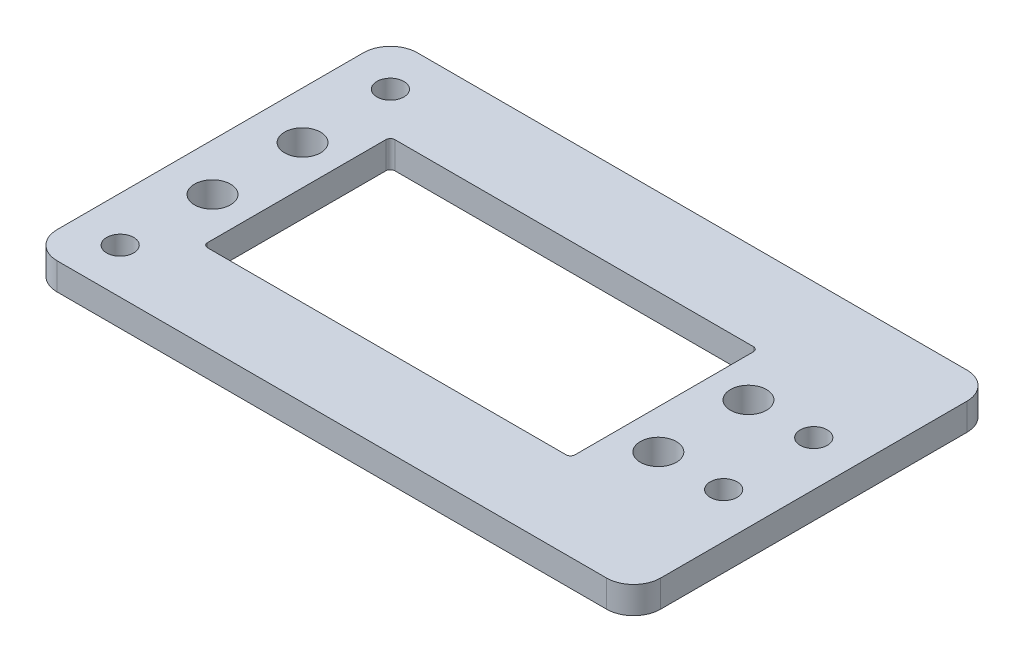
ISO-10303-21;
HEADER;
FILE_DESCRIPTION(('STEP AP214'),'2;1');
FILE_NAME('part.step','',(''),(''),'','','');
FILE_SCHEMA(('AUTOMOTIVE_DESIGN { 1 0 10303 214 1 1 1 1 }'));
ENDSEC;
DATA;
#1=APPLICATION_CONTEXT('core data for automotive mechanical design processes');
#2=APPLICATION_PROTOCOL_DEFINITION('international standard','automotive_design',2000,#1);
#3=PRODUCT_CONTEXT('',#1,'mechanical');
#4=PRODUCT('Part','Part','',(#3));
#5=PRODUCT_RELATED_PRODUCT_CATEGORY('part','',(#4));
#6=PRODUCT_DEFINITION_FORMATION('','',#4);
#7=PRODUCT_DEFINITION_CONTEXT('part definition',#1,'design');
#8=PRODUCT_DEFINITION('design','',#6,#7);
#9=PRODUCT_DEFINITION_SHAPE('','',#8);
#10=(LENGTH_UNIT() NAMED_UNIT(*) SI_UNIT(.MILLI.,.METRE.));
#11=(NAMED_UNIT(*) PLANE_ANGLE_UNIT() SI_UNIT($,.RADIAN.));
#12=(NAMED_UNIT(*) SI_UNIT($,.STERADIAN.) SOLID_ANGLE_UNIT());
#13=UNCERTAINTY_MEASURE_WITH_UNIT(LENGTH_MEASURE(1.E-05),#10,'distance_accuracy_value','');
#14=(GEOMETRIC_REPRESENTATION_CONTEXT(3) GLOBAL_UNCERTAINTY_ASSIGNED_CONTEXT((#13)) GLOBAL_UNIT_ASSIGNED_CONTEXT((#10,
#11,#12)) REPRESENTATION_CONTEXT('',''));
#15=CARTESIAN_POINT('',(0.,0.,0.));
#16=DIRECTION('',(0.,0.,1.));
#17=DIRECTION('',(1.,0.,0.));
#18=AXIS2_PLACEMENT_3D('',#15,#16,#17);
#19=CARTESIAN_POINT('',(20.4,3.,0.));
#20=DIRECTION('',(-1.,0.,0.));
#21=DIRECTION('',(0.,0.,1.));
#22=AXIS2_PLACEMENT_3D('',#19,#20,#21);
#23=PLANE('',#22);
#24=DIRECTION('',(0.,0.,-1.));
#25=VECTOR('',#24,1.);
#26=CARTESIAN_POINT('',(20.4,0.,0.));
#27=LINE('',#26,#25);
#28=CARTESIAN_POINT('',(20.4,0.,9.9));
#29=VERTEX_POINT('',#28);
#30=CARTESIAN_POINT('',(20.4,0.,-9.9));
#31=VERTEX_POINT('',#30);
#32=EDGE_CURVE('E180',#29,#31,#27,.T.);
#33=ORIENTED_EDGE('',*,*,#32,.F.);
#34=DIRECTION('',(0.,-1.,0.));
#35=VECTOR('',#34,1.);
#36=CARTESIAN_POINT('',(20.4,3.,9.9));
#37=LINE('',#36,#35);
#38=CARTESIAN_POINT('',(20.4,3.,9.9));
#39=VERTEX_POINT('',#38);
#40=EDGE_CURVE('E197',#29,#39,#37,.F.);
#41=ORIENTED_EDGE('',*,*,#40,.T.);
#42=DIRECTION('',(0.,0.,-1.));
#43=VECTOR('',#42,1.);
#44=CARTESIAN_POINT('',(20.4,3.,0.));
#45=LINE('',#44,#43);
#46=CARTESIAN_POINT('',(20.4,3.,-9.9));
#47=VERTEX_POINT('',#46);
#48=EDGE_CURVE('E317',#39,#47,#45,.T.);
#49=ORIENTED_EDGE('',*,*,#48,.T.);
#50=DIRECTION('',(0.,-1.,0.));
#51=VECTOR('',#50,1.);
#52=CARTESIAN_POINT('',(20.4,3.,-9.9));
#53=LINE('',#52,#51);
#54=EDGE_CURVE('E186',#47,#31,#53,.T.);
#55=ORIENTED_EDGE('',*,*,#54,.T.);
#56=EDGE_LOOP('',(#33,#41,#49,#55));
#57=FACE_BOUND('',#56,.T.);
#58=ADVANCED_FACE('F44',(#57),#23,.T.);
#59=CARTESIAN_POINT('',(0.,3.,10.4));
#60=DIRECTION('',(0.,0.,-1.));
#61=DIRECTION('',(-1.,0.,0.));
#62=AXIS2_PLACEMENT_3D('',#59,#60,#61);
#63=PLANE('',#62);
#64=DIRECTION('',(1.,0.,0.));
#65=VECTOR('',#64,1.);
#66=CARTESIAN_POINT('',(0.,3.,10.4));
#67=LINE('',#66,#65);
#68=CARTESIAN_POINT('',(-19.9,3.,10.4));
#69=VERTEX_POINT('',#68);
#70=CARTESIAN_POINT('',(19.9,3.,10.4));
#71=VERTEX_POINT('',#70);
#72=EDGE_CURVE('E320',#69,#71,#67,.T.);
#73=ORIENTED_EDGE('',*,*,#72,.T.);
#74=DIRECTION('',(0.,-1.,0.));
#75=VECTOR('',#74,1.);
#76=CARTESIAN_POINT('',(19.9,0.,10.4));
#77=LINE('',#76,#75);
#78=CARTESIAN_POINT('',(19.9,0.,10.4));
#79=VERTEX_POINT('',#78);
#80=EDGE_CURVE('E179',#71,#79,#77,.T.);
#81=ORIENTED_EDGE('',*,*,#80,.T.);
#82=DIRECTION('',(1.,0.,0.));
#83=VECTOR('',#82,1.);
#84=CARTESIAN_POINT('',(0.,0.,10.4));
#85=LINE('',#84,#83);
#86=CARTESIAN_POINT('',(-19.9,0.,10.4));
#87=VERTEX_POINT('',#86);
#88=EDGE_CURVE('E162',#87,#79,#85,.T.);
#89=ORIENTED_EDGE('',*,*,#88,.F.);
#90=DIRECTION('',(0.,-1.,0.));
#91=VECTOR('',#90,1.);
#92=CARTESIAN_POINT('',(-19.9,3.,10.4));
#93=LINE('',#92,#91);
#94=EDGE_CURVE('E176',#87,#69,#93,.F.);
#95=ORIENTED_EDGE('',*,*,#94,.T.);
#96=EDGE_LOOP('',(#73,#81,#89,#95));
#97=FACE_BOUND('',#96,.T.);
#98=ADVANCED_FACE('F175',(#97),#63,.T.);
#99=CARTESIAN_POINT('',(-20.4,3.,0.));
#100=DIRECTION('',(-1.,0.,0.));
#101=DIRECTION('',(0.,0.,1.));
#102=AXIS2_PLACEMENT_3D('',#99,#100,#101);
#103=PLANE('',#102);
#104=DIRECTION('',(0.,0.,-1.));
#105=VECTOR('',#104,1.);
#106=CARTESIAN_POINT('',(-20.4,3.,0.));
#107=LINE('',#106,#105);
#108=CARTESIAN_POINT('',(-20.4,3.,9.9));
#109=VERTEX_POINT('',#108);
#110=CARTESIAN_POINT('',(-20.4,3.,-9.9));
#111=VERTEX_POINT('',#110);
#112=EDGE_CURVE('E322',#109,#111,#107,.T.);
#113=ORIENTED_EDGE('',*,*,#112,.F.);
#114=DIRECTION('',(0.,-1.,0.));
#115=VECTOR('',#114,1.);
#116=CARTESIAN_POINT('',(-20.4,3.,9.9));
#117=LINE('',#116,#115);
#118=CARTESIAN_POINT('',(-20.4,0.,9.9));
#119=VERTEX_POINT('',#118);
#120=EDGE_CURVE('E201',#109,#119,#117,.T.);
#121=ORIENTED_EDGE('',*,*,#120,.T.);
#122=DIRECTION('',(0.,0.,-1.));
#123=VECTOR('',#122,1.);
#124=CARTESIAN_POINT('',(-20.4,0.,0.));
#125=LINE('',#124,#123);
#126=CARTESIAN_POINT('',(-20.4,0.,-9.9));
#127=VERTEX_POINT('',#126);
#128=EDGE_CURVE('E164',#119,#127,#125,.T.);
#129=ORIENTED_EDGE('',*,*,#128,.T.);
#130=DIRECTION('',(0.,-1.,0.));
#131=VECTOR('',#130,1.);
#132=CARTESIAN_POINT('',(-20.4,3.,-9.9));
#133=LINE('',#132,#131);
#134=EDGE_CURVE('E199',#127,#111,#133,.F.);
#135=ORIENTED_EDGE('',*,*,#134,.T.);
#136=EDGE_LOOP('',(#113,#121,#129,#135));
#137=FACE_BOUND('',#136,.T.);
#138=ADVANCED_FACE('F372',(#137),#103,.F.);
#139=CARTESIAN_POINT('',(0.,3.,20.));
#140=DIRECTION('',(0.,0.,-1.));
#141=DIRECTION('',(-1.,0.,0.));
#142=AXIS2_PLACEMENT_3D('',#139,#140,#141);
#143=PLANE('',#142);
#144=DIRECTION('',(1.,0.,0.));
#145=VECTOR('',#144,1.);
#146=CARTESIAN_POINT('',(0.,3.,20.));
#147=LINE('',#146,#145);
#148=CARTESIAN_POINT('',(-27.,3.,20.));
#149=VERTEX_POINT('',#148);
#150=CARTESIAN_POINT('',(34.,3.,20.));
#151=VERTEX_POINT('',#150);
#152=EDGE_CURVE('E306',#149,#151,#147,.T.);
#153=ORIENTED_EDGE('',*,*,#152,.F.);
#154=DIRECTION('',(0.,-1.,0.));
#155=VECTOR('',#154,1.);
#156=CARTESIAN_POINT('',(-27.,0.,20.));
#157=LINE('',#156,#155);
#158=CARTESIAN_POINT('',(-27.,0.,20.));
#159=VERTEX_POINT('',#158);
#160=EDGE_CURVE('E222',#149,#159,#157,.T.);
#161=ORIENTED_EDGE('',*,*,#160,.T.);
#162=DIRECTION('',(1.,0.,0.));
#163=VECTOR('',#162,1.);
#164=CARTESIAN_POINT('',(0.,0.,20.));
#165=LINE('',#164,#163);
#166=CARTESIAN_POINT('',(34.,0.,20.));
#167=VERTEX_POINT('',#166);
#168=EDGE_CURVE('E265',#159,#167,#165,.T.);
#169=ORIENTED_EDGE('',*,*,#168,.T.);
#170=DIRECTION('',(0.,-1.,0.));
#171=VECTOR('',#170,1.);
#172=CARTESIAN_POINT('',(34.,3.,20.));
#173=LINE('',#172,#171);
#174=EDGE_CURVE('E220',#167,#151,#173,.F.);
#175=ORIENTED_EDGE('',*,*,#174,.T.);
#176=EDGE_LOOP('',(#153,#161,#169,#175));
#177=FACE_BOUND('',#176,.T.);
#178=ADVANCED_FACE('F382',(#177),#143,.F.);
#179=CARTESIAN_POINT('',(37.,3.,0.));
#180=DIRECTION('',(1.,0.,0.));
#181=DIRECTION('',(0.,0.,-1.));
#182=AXIS2_PLACEMENT_3D('',#179,#180,#181);
#183=PLANE('',#182);
#184=DIRECTION('',(0.,0.,1.));
#185=VECTOR('',#184,1.);
#186=CARTESIAN_POINT('',(37.,3.,0.));
#187=LINE('',#186,#185);
#188=CARTESIAN_POINT('',(37.,3.,-17.));
#189=VERTEX_POINT('',#188);
#190=CARTESIAN_POINT('',(37.,3.,17.));
#191=VERTEX_POINT('',#190);
#192=EDGE_CURVE('E257',#189,#191,#187,.T.);
#193=ORIENTED_EDGE('',*,*,#192,.T.);
#194=DIRECTION('',(0.,-1.,0.));
#195=VECTOR('',#194,1.);
#196=CARTESIAN_POINT('',(37.,0.,17.));
#197=LINE('',#196,#195);
#198=CARTESIAN_POINT('',(37.,0.,17.));
#199=VERTEX_POINT('',#198);
#200=EDGE_CURVE('E247',#191,#199,#197,.T.);
#201=ORIENTED_EDGE('',*,*,#200,.T.);
#202=DIRECTION('',(0.,0.,1.));
#203=VECTOR('',#202,1.);
#204=CARTESIAN_POINT('',(37.,0.,0.));
#205=LINE('',#204,#203);
#206=CARTESIAN_POINT('',(37.,0.,-17.));
#207=VERTEX_POINT('',#206);
#208=EDGE_CURVE('E255',#207,#199,#205,.T.);
#209=ORIENTED_EDGE('',*,*,#208,.F.);
#210=DIRECTION('',(0.,-1.,0.));
#211=VECTOR('',#210,1.);
#212=CARTESIAN_POINT('',(37.,3.,-17.));
#213=LINE('',#212,#211);
#214=EDGE_CURVE('E245',#207,#189,#213,.F.);
#215=ORIENTED_EDGE('',*,*,#214,.T.);
#216=EDGE_LOOP('',(#193,#201,#209,#215));
#217=FACE_BOUND('',#216,.T.);
#218=ADVANCED_FACE('F254',(#217),#183,.T.);
#219=CARTESIAN_POINT('',(0.,3.,-20.));
#220=DIRECTION('',(0.,0.,-1.));
#221=DIRECTION('',(-1.,0.,0.));
#222=AXIS2_PLACEMENT_3D('',#219,#220,#221);
#223=PLANE('',#222);
#224=DIRECTION('',(1.,0.,0.));
#225=VECTOR('',#224,1.);
#226=CARTESIAN_POINT('',(0.,3.,-20.));
#227=LINE('',#226,#225);
#228=CARTESIAN_POINT('',(-27.,3.,-20.));
#229=VERTEX_POINT('',#228);
#230=CARTESIAN_POINT('',(34.,3.,-20.));
#231=VERTEX_POINT('',#230);
#232=EDGE_CURVE('E312',#229,#231,#227,.T.);
#233=ORIENTED_EDGE('',*,*,#232,.T.);
#234=DIRECTION('',(0.,-1.,0.));
#235=VECTOR('',#234,1.);
#236=CARTESIAN_POINT('',(34.,3.,-20.));
#237=LINE('',#236,#235);
#238=CARTESIAN_POINT('',(34.,0.,-20.));
#239=VERTEX_POINT('',#238);
#240=EDGE_CURVE('E11',#231,#239,#237,.T.);
#241=ORIENTED_EDGE('',*,*,#240,.T.);
#242=DIRECTION('',(1.,0.,0.));
#243=VECTOR('',#242,1.);
#244=CARTESIAN_POINT('',(0.,0.,-20.));
#245=LINE('',#244,#243);
#246=CARTESIAN_POINT('',(-27.,0.,-20.));
#247=VERTEX_POINT('',#246);
#248=EDGE_CURVE('E264',#247,#239,#245,.T.);
#249=ORIENTED_EDGE('',*,*,#248,.F.);
#250=DIRECTION('',(0.,-1.,0.));
#251=VECTOR('',#250,1.);
#252=CARTESIAN_POINT('',(-27.,3.,-20.));
#253=LINE('',#252,#251);
#254=EDGE_CURVE('E52',#247,#229,#253,.F.);
#255=ORIENTED_EDGE('',*,*,#254,.T.);
#256=EDGE_LOOP('',(#233,#241,#249,#255));
#257=FACE_BOUND('',#256,.T.);
#258=ADVANCED_FACE('F377',(#257),#223,.T.);
#259=CARTESIAN_POINT('',(32.,3.,-5.));
#260=DIRECTION('',(0.,-1.,0.));
#261=DIRECTION('',(0.,0.,-1.));
#262=AXIS2_PLACEMENT_3D('',#259,#260,#261);
#263=CYLINDRICAL_SURFACE('',#262,1.5);
#264=CARTESIAN_POINT('',(32.,3.,-5.));
#265=DIRECTION('',(0.,1.,0.));
#266=DIRECTION('',(0.,0.,1.));
#267=AXIS2_PLACEMENT_3D('',#264,#265,#266);
#268=CIRCLE('',#267,1.5);
#269=CARTESIAN_POINT('',(32.,3.,-3.5));
#270=VERTEX_POINT('',#269);
#271=EDGE_CURVE('E189',#270,#270,#268,.T.);
#272=ORIENTED_EDGE('',*,*,#271,.T.);
#273=EDGE_LOOP('',(#272));
#274=FACE_BOUND('',#273,.T.);
#275=CARTESIAN_POINT('',(32.,0.,-5.));
#276=DIRECTION('',(0.,1.,0.));
#277=DIRECTION('',(0.,0.,1.));
#278=AXIS2_PLACEMENT_3D('',#275,#276,#277);
#279=CIRCLE('',#278,1.5);
#280=CARTESIAN_POINT('',(32.,0.,-3.5));
#281=VERTEX_POINT('',#280);
#282=EDGE_CURVE('E292',#281,#281,#279,.T.);
#283=ORIENTED_EDGE('',*,*,#282,.F.);
#284=EDGE_LOOP('',(#283));
#285=FACE_BOUND('',#284,.T.);
#286=ADVANCED_FACE('F380',(#274,#285),#263,.F.);
#287=CARTESIAN_POINT('',(-25.,3.,15.));
#288=DIRECTION('',(0.,-1.,0.));
#289=DIRECTION('',(0.,0.,-1.));
#290=AXIS2_PLACEMENT_3D('',#287,#288,#289);
#291=CYLINDRICAL_SURFACE('',#290,1.5);
#292=CARTESIAN_POINT('',(-25.,3.,15.));
#293=DIRECTION('',(0.,1.,0.));
#294=DIRECTION('',(0.,0.,1.));
#295=AXIS2_PLACEMENT_3D('',#292,#293,#294);
#296=CIRCLE('',#295,1.5);
#297=CARTESIAN_POINT('',(-25.,3.,16.5));
#298=VERTEX_POINT('',#297);
#299=EDGE_CURVE('E337',#298,#298,#296,.F.);
#300=ORIENTED_EDGE('',*,*,#299,.F.);
#301=EDGE_LOOP('',(#300));
#302=FACE_BOUND('',#301,.T.);
#303=CARTESIAN_POINT('',(-25.,0.,15.));
#304=DIRECTION('',(0.,1.,0.));
#305=DIRECTION('',(0.,0.,1.));
#306=AXIS2_PLACEMENT_3D('',#303,#304,#305);
#307=CIRCLE('',#306,1.5);
#308=CARTESIAN_POINT('',(-25.,0.,16.5));
#309=VERTEX_POINT('',#308);
#310=EDGE_CURVE('E290',#309,#309,#307,.F.);
#311=ORIENTED_EDGE('',*,*,#310,.T.);
#312=EDGE_LOOP('',(#311));
#313=FACE_BOUND('',#312,.T.);
#314=ADVANCED_FACE('F465',(#302,#313),#291,.F.);
#315=CARTESIAN_POINT('',(-25.,3.,-15.));
#316=DIRECTION('',(0.,-1.,0.));
#317=DIRECTION('',(0.,0.,-1.));
#318=AXIS2_PLACEMENT_3D('',#315,#316,#317);
#319=CYLINDRICAL_SURFACE('',#318,1.5);
#320=CARTESIAN_POINT('',(-25.,3.,-15.));
#321=DIRECTION('',(0.,1.,0.));
#322=DIRECTION('',(0.,0.,1.));
#323=AXIS2_PLACEMENT_3D('',#320,#321,#322);
#324=CIRCLE('',#323,1.5);
#325=CARTESIAN_POINT('',(-25.,3.,-13.5));
#326=VERTEX_POINT('',#325);
#327=EDGE_CURVE('E334',#326,#326,#324,.T.);
#328=ORIENTED_EDGE('',*,*,#327,.T.);
#329=EDGE_LOOP('',(#328));
#330=FACE_BOUND('',#329,.T.);
#331=CARTESIAN_POINT('',(-25.,0.,-15.));
#332=DIRECTION('',(0.,1.,0.));
#333=DIRECTION('',(0.,0.,1.));
#334=AXIS2_PLACEMENT_3D('',#331,#332,#333);
#335=CIRCLE('',#334,1.5);
#336=CARTESIAN_POINT('',(-25.,0.,-13.5));
#337=VERTEX_POINT('',#336);
#338=EDGE_CURVE('E287',#337,#337,#335,.T.);
#339=ORIENTED_EDGE('',*,*,#338,.F.);
#340=EDGE_LOOP('',(#339));
#341=FACE_BOUND('',#340,.T.);
#342=ADVANCED_FACE('F461',(#330,#341),#319,.F.);
#343=CARTESIAN_POINT('',(24.75,3.,4.99999999999999));
#344=DIRECTION('',(0.,-1.,0.));
#345=DIRECTION('',(0.,0.,-1.));
#346=AXIS2_PLACEMENT_3D('',#343,#344,#345);
#347=CYLINDRICAL_SURFACE('',#346,2.);
#348=CARTESIAN_POINT('',(24.75,3.,4.99999999999999));
#349=DIRECTION('',(0.,1.,0.));
#350=DIRECTION('',(0.,0.,1.));
#351=AXIS2_PLACEMENT_3D('',#348,#349,#350);
#352=CIRCLE('',#351,2.);
#353=CARTESIAN_POINT('',(24.75,3.,7.));
#354=VERTEX_POINT('',#353);
#355=EDGE_CURVE('E331',#354,#354,#352,.F.);
#356=ORIENTED_EDGE('',*,*,#355,.F.);
#357=EDGE_LOOP('',(#356));
#358=FACE_BOUND('',#357,.T.);
#359=CARTESIAN_POINT('',(24.75,0.,4.99999999999999));
#360=DIRECTION('',(0.,1.,0.));
#361=DIRECTION('',(0.,0.,1.));
#362=AXIS2_PLACEMENT_3D('',#359,#360,#361);
#363=CIRCLE('',#362,2.);
#364=CARTESIAN_POINT('',(24.75,0.,7.));
#365=VERTEX_POINT('',#364);
#366=EDGE_CURVE('E284',#365,#365,#363,.F.);
#367=ORIENTED_EDGE('',*,*,#366,.T.);
#368=EDGE_LOOP('',(#367));
#369=FACE_BOUND('',#368,.T.);
#370=ADVANCED_FACE('F455',(#358,#369),#347,.F.);
#371=CARTESIAN_POINT('',(24.75,3.,-5.00000000000001));
#372=DIRECTION('',(0.,-1.,0.));
#373=DIRECTION('',(0.,0.,-1.));
#374=AXIS2_PLACEMENT_3D('',#371,#372,#373);
#375=CYLINDRICAL_SURFACE('',#374,2.);
#376=CARTESIAN_POINT('',(24.75,3.,-5.00000000000001));
#377=DIRECTION('',(0.,1.,0.));
#378=DIRECTION('',(0.,0.,1.));
#379=AXIS2_PLACEMENT_3D('',#376,#377,#378);
#380=CIRCLE('',#379,2.);
#381=CARTESIAN_POINT('',(24.75,3.,-3.));
#382=VERTEX_POINT('',#381);
#383=EDGE_CURVE('E328',#382,#382,#380,.T.);
#384=ORIENTED_EDGE('',*,*,#383,.T.);
#385=EDGE_LOOP('',(#384));
#386=FACE_BOUND('',#385,.T.);
#387=CARTESIAN_POINT('',(24.75,0.,-5.00000000000001));
#388=DIRECTION('',(0.,1.,0.));
#389=DIRECTION('',(0.,0.,1.));
#390=AXIS2_PLACEMENT_3D('',#387,#388,#389);
#391=CIRCLE('',#390,2.);
#392=CARTESIAN_POINT('',(24.75,0.,-3.));
#393=VERTEX_POINT('',#392);
#394=EDGE_CURVE('E281',#393,#393,#391,.T.);
#395=ORIENTED_EDGE('',*,*,#394,.F.);
#396=EDGE_LOOP('',(#395));
#397=FACE_BOUND('',#396,.T.);
#398=ADVANCED_FACE('F450',(#386,#397),#375,.F.);
#399=CARTESIAN_POINT('',(0.,3.,-10.4));
#400=DIRECTION('',(0.,0.,-1.));
#401=DIRECTION('',(-1.,0.,0.));
#402=AXIS2_PLACEMENT_3D('',#399,#400,#401);
#403=PLANE('',#402);
#404=DIRECTION('',(1.,0.,0.));
#405=VECTOR('',#404,1.);
#406=CARTESIAN_POINT('',(0.,0.,-10.4));
#407=LINE('',#406,#405);
#408=CARTESIAN_POINT('',(-19.9,0.,-10.4));
#409=VERTEX_POINT('',#408);
#410=CARTESIAN_POINT('',(19.9,0.,-10.4));
#411=VERTEX_POINT('',#410);
#412=EDGE_CURVE('E278',#409,#411,#407,.T.);
#413=ORIENTED_EDGE('',*,*,#412,.T.);
#414=DIRECTION('',(0.,-1.,0.));
#415=VECTOR('',#414,1.);
#416=CARTESIAN_POINT('',(19.9,3.,-10.4));
#417=LINE('',#416,#415);
#418=CARTESIAN_POINT('',(19.9,3.,-10.4));
#419=VERTEX_POINT('',#418);
#420=EDGE_CURVE('E206',#411,#419,#417,.F.);
#421=ORIENTED_EDGE('',*,*,#420,.T.);
#422=DIRECTION('',(1.,0.,0.));
#423=VECTOR('',#422,1.);
#424=CARTESIAN_POINT('',(0.,3.,-10.4));
#425=LINE('',#424,#423);
#426=CARTESIAN_POINT('',(-19.9,3.,-10.4));
#427=VERTEX_POINT('',#426);
#428=EDGE_CURVE('E325',#427,#419,#425,.T.);
#429=ORIENTED_EDGE('',*,*,#428,.F.);
#430=DIRECTION('',(0.,-1.,0.));
#431=VECTOR('',#430,1.);
#432=CARTESIAN_POINT('',(-19.9,0.,-10.4));
#433=LINE('',#432,#431);
#434=EDGE_CURVE('E203',#427,#409,#433,.T.);
#435=ORIENTED_EDGE('',*,*,#434,.T.);
#436=EDGE_LOOP('',(#413,#421,#429,#435));
#437=FACE_BOUND('',#436,.T.);
#438=ADVANCED_FACE('F362',(#437),#403,.F.);
#439=CARTESIAN_POINT('',(-30.,3.,0.));
#440=DIRECTION('',(-1.,0.,0.));
#441=DIRECTION('',(0.,0.,1.));
#442=AXIS2_PLACEMENT_3D('',#439,#440,#441);
#443=PLANE('',#442);
#444=DIRECTION('',(0.,0.,-1.));
#445=VECTOR('',#444,1.);
#446=CARTESIAN_POINT('',(-30.,0.,0.));
#447=LINE('',#446,#445);
#448=CARTESIAN_POINT('',(-30.,0.,17.));
#449=VERTEX_POINT('',#448);
#450=CARTESIAN_POINT('',(-30.,0.,-17.));
#451=VERTEX_POINT('',#450);
#452=EDGE_CURVE('E267',#449,#451,#447,.T.);
#453=ORIENTED_EDGE('',*,*,#452,.F.);
#454=DIRECTION('',(0.,-1.,0.));
#455=VECTOR('',#454,1.);
#456=CARTESIAN_POINT('',(-30.,3.,17.));
#457=LINE('',#456,#455);
#458=CARTESIAN_POINT('',(-30.,3.,17.));
#459=VERTEX_POINT('',#458);
#460=EDGE_CURVE('E236',#449,#459,#457,.F.);
#461=ORIENTED_EDGE('',*,*,#460,.T.);
#462=DIRECTION('',(0.,0.,-1.));
#463=VECTOR('',#462,1.);
#464=CARTESIAN_POINT('',(-30.,3.,0.));
#465=LINE('',#464,#463);
#466=CARTESIAN_POINT('',(-30.,3.,-17.));
#467=VERTEX_POINT('',#466);
#468=EDGE_CURVE('E314',#459,#467,#465,.T.);
#469=ORIENTED_EDGE('',*,*,#468,.T.);
#470=DIRECTION('',(0.,-1.,0.));
#471=VECTOR('',#470,1.);
#472=CARTESIAN_POINT('',(-30.,3.,-17.));
#473=LINE('',#472,#471);
#474=EDGE_CURVE('E233',#467,#451,#473,.T.);
#475=ORIENTED_EDGE('',*,*,#474,.T.);
#476=EDGE_LOOP('',(#453,#461,#469,#475));
#477=FACE_BOUND('',#476,.T.);
#478=ADVANCED_FACE('F351',(#477),#443,.T.);
#479=CARTESIAN_POINT('',(-24.75,3.,4.99999999999999));
#480=DIRECTION('',(0.,-1.,0.));
#481=DIRECTION('',(0.,0.,-1.));
#482=AXIS2_PLACEMENT_3D('',#479,#480,#481);
#483=CYLINDRICAL_SURFACE('',#482,2.);
#484=CARTESIAN_POINT('',(-24.75,3.,4.99999999999999));
#485=DIRECTION('',(0.,1.,0.));
#486=DIRECTION('',(0.,0.,1.));
#487=AXIS2_PLACEMENT_3D('',#484,#485,#486);
#488=CIRCLE('',#487,2.);
#489=CARTESIAN_POINT('',(-24.75,3.,7.));
#490=VERTEX_POINT('',#489);
#491=EDGE_CURVE('E301',#490,#490,#488,.T.);
#492=ORIENTED_EDGE('',*,*,#491,.T.);
#493=EDGE_LOOP('',(#492));
#494=FACE_BOUND('',#493,.T.);
#495=CARTESIAN_POINT('',(-24.75,0.,4.99999999999999));
#496=DIRECTION('',(0.,1.,0.));
#497=DIRECTION('',(0.,0.,1.));
#498=AXIS2_PLACEMENT_3D('',#495,#496,#497);
#499=CIRCLE('',#498,2.);
#500=CARTESIAN_POINT('',(-24.75,0.,7.));
#501=VERTEX_POINT('',#500);
#502=EDGE_CURVE('E269',#501,#501,#499,.T.);
#503=ORIENTED_EDGE('',*,*,#502,.F.);
#504=EDGE_LOOP('',(#503));
#505=FACE_BOUND('',#504,.T.);
#506=ADVANCED_FACE('F348',(#494,#505),#483,.F.);
#507=CARTESIAN_POINT('',(-24.75,3.,-5.00000000000001));
#508=DIRECTION('',(0.,-1.,0.));
#509=DIRECTION('',(0.,0.,-1.));
#510=AXIS2_PLACEMENT_3D('',#507,#508,#509);
#511=CYLINDRICAL_SURFACE('',#510,2.);
#512=CARTESIAN_POINT('',(-24.75,3.,-5.00000000000001));
#513=DIRECTION('',(0.,1.,0.));
#514=DIRECTION('',(0.,0.,1.));
#515=AXIS2_PLACEMENT_3D('',#512,#513,#514);
#516=CIRCLE('',#515,2.);
#517=CARTESIAN_POINT('',(-24.75,3.,-3.));
#518=VERTEX_POINT('',#517);
#519=EDGE_CURVE('E297',#518,#518,#516,.F.);
#520=ORIENTED_EDGE('',*,*,#519,.F.);
#521=EDGE_LOOP('',(#520));
#522=FACE_BOUND('',#521,.T.);
#523=CARTESIAN_POINT('',(-24.75,0.,-5.00000000000001));
#524=DIRECTION('',(0.,1.,0.));
#525=DIRECTION('',(0.,0.,1.));
#526=AXIS2_PLACEMENT_3D('',#523,#524,#525);
#527=CIRCLE('',#526,2.);
#528=CARTESIAN_POINT('',(-24.75,0.,-3.));
#529=VERTEX_POINT('',#528);
#530=EDGE_CURVE('E342',#529,#529,#527,.F.);
#531=ORIENTED_EDGE('',*,*,#530,.T.);
#532=EDGE_LOOP('',(#531));
#533=FACE_BOUND('',#532,.T.);
#534=ADVANCED_FACE('F350',(#522,#533),#511,.F.);
#535=CARTESIAN_POINT('',(32.,3.,5.));
#536=DIRECTION('',(0.,-1.,0.));
#537=DIRECTION('',(0.,0.,-1.));
#538=AXIS2_PLACEMENT_3D('',#535,#536,#537);
#539=CYLINDRICAL_SURFACE('',#538,1.5);
#540=CARTESIAN_POINT('',(32.,3.,5.));
#541=DIRECTION('',(0.,1.,0.));
#542=DIRECTION('',(0.,0.,1.));
#543=AXIS2_PLACEMENT_3D('',#540,#541,#542);
#544=CIRCLE('',#543,1.5);
#545=CARTESIAN_POINT('',(32.,3.,6.5));
#546=VERTEX_POINT('',#545);
#547=EDGE_CURVE('E184',#546,#546,#544,.F.);
#548=ORIENTED_EDGE('',*,*,#547,.F.);
#549=EDGE_LOOP('',(#548));
#550=FACE_BOUND('',#549,.T.);
#551=CARTESIAN_POINT('',(32.,0.,5.));
#552=DIRECTION('',(0.,1.,0.));
#553=DIRECTION('',(0.,0.,1.));
#554=AXIS2_PLACEMENT_3D('',#551,#552,#553);
#555=CIRCLE('',#554,1.5);
#556=CARTESIAN_POINT('',(32.,0.,6.5));
#557=VERTEX_POINT('',#556);
#558=EDGE_CURVE('E192',#557,#557,#555,.F.);
#559=ORIENTED_EDGE('',*,*,#558,.T.);
#560=EDGE_LOOP('',(#559));
#561=FACE_BOUND('',#560,.T.);
#562=ADVANCED_FACE('F358',(#550,#561),#539,.F.);
#563=CARTESIAN_POINT('',(0.,3.,0.));
#564=DIRECTION('',(0.,1.,0.));
#565=DIRECTION('',(0.,0.,1.));
#566=AXIS2_PLACEMENT_3D('',#563,#564,#565);
#567=PLANE('',#566);
#568=ORIENTED_EDGE('',*,*,#519,.T.);
#569=EDGE_LOOP('',(#568));
#570=FACE_BOUND('',#569,.T.);
#571=ORIENTED_EDGE('',*,*,#491,.F.);
#572=EDGE_LOOP('',(#571));
#573=FACE_BOUND('',#572,.T.);
#574=ORIENTED_EDGE('',*,*,#468,.F.);
#575=CARTESIAN_POINT('',(-27.,3.,17.));
#576=DIRECTION('',(0.,1.,0.));
#577=DIRECTION('',(0.,0.,1.));
#578=AXIS2_PLACEMENT_3D('',#575,#576,#577);
#579=CIRCLE('',#578,3.);
#580=EDGE_CURVE('E243',#459,#149,#579,.T.);
#581=ORIENTED_EDGE('',*,*,#580,.T.);
#582=ORIENTED_EDGE('',*,*,#152,.T.);
#583=CARTESIAN_POINT('',(34.,3.,17.));
#584=DIRECTION('',(0.,1.,0.));
#585=DIRECTION('',(0.,0.,1.));
#586=AXIS2_PLACEMENT_3D('',#583,#584,#585);
#587=CIRCLE('',#586,3.);
#588=EDGE_CURVE('E241',#151,#191,#587,.T.);
#589=ORIENTED_EDGE('',*,*,#588,.T.);
#590=ORIENTED_EDGE('',*,*,#192,.F.);
#591=CARTESIAN_POINT('',(34.,3.,-17.));
#592=DIRECTION('',(0.,1.,0.));
#593=DIRECTION('',(0.,0.,1.));
#594=AXIS2_PLACEMENT_3D('',#591,#592,#593);
#595=CIRCLE('',#594,3.);
#596=EDGE_CURVE('E59',#189,#231,#595,.T.);
#597=ORIENTED_EDGE('',*,*,#596,.T.);
#598=ORIENTED_EDGE('',*,*,#232,.F.);
#599=CARTESIAN_POINT('',(-27.,3.,-17.));
#600=DIRECTION('',(0.,1.,0.));
#601=DIRECTION('',(0.,0.,1.));
#602=AXIS2_PLACEMENT_3D('',#599,#600,#601);
#603=CIRCLE('',#602,3.);
#604=EDGE_CURVE('E238',#229,#467,#603,.T.);
#605=ORIENTED_EDGE('',*,*,#604,.T.);
#606=EDGE_LOOP('',(#574,#581,#582,#589,#590,#597,#598,#605));
#607=FACE_BOUND('',#606,.T.);
#608=ORIENTED_EDGE('',*,*,#48,.F.);
#609=CARTESIAN_POINT('',(19.9,3.,9.9));
#610=DIRECTION('',(0.,1.,0.));
#611=DIRECTION('',(0.,0.,1.));
#612=AXIS2_PLACEMENT_3D('',#609,#610,#611);
#613=CIRCLE('',#612,0.5);
#614=EDGE_CURVE('E170',#39,#71,#613,.F.);
#615=ORIENTED_EDGE('',*,*,#614,.T.);
#616=ORIENTED_EDGE('',*,*,#72,.F.);
#617=CARTESIAN_POINT('',(-19.9,3.,9.9));
#618=DIRECTION('',(0.,1.,0.));
#619=DIRECTION('',(0.,0.,1.));
#620=AXIS2_PLACEMENT_3D('',#617,#618,#619);
#621=CIRCLE('',#620,0.5);
#622=EDGE_CURVE('E169',#69,#109,#621,.F.);
#623=ORIENTED_EDGE('',*,*,#622,.T.);
#624=ORIENTED_EDGE('',*,*,#112,.T.);
#625=CARTESIAN_POINT('',(-19.9,3.,-9.9));
#626=DIRECTION('',(0.,1.,0.));
#627=DIRECTION('',(0.,0.,1.));
#628=AXIS2_PLACEMENT_3D('',#625,#626,#627);
#629=CIRCLE('',#628,0.5);
#630=EDGE_CURVE('E218',#111,#427,#629,.F.);
#631=ORIENTED_EDGE('',*,*,#630,.T.);
#632=ORIENTED_EDGE('',*,*,#428,.T.);
#633=CARTESIAN_POINT('',(19.9,3.,-9.9));
#634=DIRECTION('',(0.,1.,0.));
#635=DIRECTION('',(0.,0.,1.));
#636=AXIS2_PLACEMENT_3D('',#633,#634,#635);
#637=CIRCLE('',#636,0.5);
#638=EDGE_CURVE('E214',#419,#47,#637,.F.);
#639=ORIENTED_EDGE('',*,*,#638,.T.);
#640=EDGE_LOOP('',(#608,#615,#616,#623,#624,#631,#632,#639));
#641=FACE_BOUND('',#640,.T.);
#642=ORIENTED_EDGE('',*,*,#383,.F.);
#643=EDGE_LOOP('',(#642));
#644=FACE_BOUND('',#643,.T.);
#645=ORIENTED_EDGE('',*,*,#355,.T.);
#646=EDGE_LOOP('',(#645));
#647=FACE_BOUND('',#646,.T.);
#648=ORIENTED_EDGE('',*,*,#327,.F.);
#649=EDGE_LOOP('',(#648));
#650=FACE_BOUND('',#649,.T.);
#651=ORIENTED_EDGE('',*,*,#299,.T.);
#652=EDGE_LOOP('',(#651));
#653=FACE_BOUND('',#652,.T.);
#654=ORIENTED_EDGE('',*,*,#271,.F.);
#655=EDGE_LOOP('',(#654));
#656=FACE_BOUND('',#655,.T.);
#657=ORIENTED_EDGE('',*,*,#547,.T.);
#658=EDGE_LOOP('',(#657));
#659=FACE_BOUND('',#658,.T.);
#660=ADVANCED_FACE('F405',(#570,#573,#607,#641,#644,#647,#650,#653,#656,#659),#567,.T.);
#661=CARTESIAN_POINT('',(0.,0.,0.));
#662=DIRECTION('',(0.,1.,0.));
#663=DIRECTION('',(0.,0.,1.));
#664=AXIS2_PLACEMENT_3D('',#661,#662,#663);
#665=PLANE('',#664);
#666=ORIENTED_EDGE('',*,*,#530,.F.);
#667=EDGE_LOOP('',(#666));
#668=FACE_BOUND('',#667,.T.);
#669=ORIENTED_EDGE('',*,*,#502,.T.);
#670=EDGE_LOOP('',(#669));
#671=FACE_BOUND('',#670,.T.);
#672=ORIENTED_EDGE('',*,*,#168,.F.);
#673=CARTESIAN_POINT('',(-27.,0.,17.));
#674=DIRECTION('',(0.,1.,0.));
#675=DIRECTION('',(0.,0.,1.));
#676=AXIS2_PLACEMENT_3D('',#673,#674,#675);
#677=CIRCLE('',#676,3.);
#678=EDGE_CURVE('E231',#159,#449,#677,.F.);
#679=ORIENTED_EDGE('',*,*,#678,.T.);
#680=ORIENTED_EDGE('',*,*,#452,.T.);
#681=CARTESIAN_POINT('',(-27.,0.,-17.));
#682=DIRECTION('',(0.,1.,0.));
#683=DIRECTION('',(0.,0.,1.));
#684=AXIS2_PLACEMENT_3D('',#681,#682,#683);
#685=CIRCLE('',#684,3.);
#686=EDGE_CURVE('E225',#451,#247,#685,.F.);
#687=ORIENTED_EDGE('',*,*,#686,.T.);
#688=ORIENTED_EDGE('',*,*,#248,.T.);
#689=CARTESIAN_POINT('',(34.,0.,-17.));
#690=DIRECTION('',(0.,1.,0.));
#691=DIRECTION('',(0.,0.,1.));
#692=AXIS2_PLACEMENT_3D('',#689,#690,#691);
#693=CIRCLE('',#692,3.);
#694=EDGE_CURVE('E227',#239,#207,#693,.F.);
#695=ORIENTED_EDGE('',*,*,#694,.T.);
#696=ORIENTED_EDGE('',*,*,#208,.T.);
#697=CARTESIAN_POINT('',(34.,0.,17.));
#698=DIRECTION('',(0.,1.,0.));
#699=DIRECTION('',(0.,0.,1.));
#700=AXIS2_PLACEMENT_3D('',#697,#698,#699);
#701=CIRCLE('',#700,3.);
#702=EDGE_CURVE('E229',#199,#167,#701,.F.);
#703=ORIENTED_EDGE('',*,*,#702,.T.);
#704=EDGE_LOOP('',(#672,#679,#680,#687,#688,#695,#696,#703));
#705=FACE_BOUND('',#704,.T.);
#706=ORIENTED_EDGE('',*,*,#88,.T.);
#707=CARTESIAN_POINT('',(19.9,0.,9.9));
#708=DIRECTION('',(0.,1.,0.));
#709=DIRECTION('',(0.,0.,1.));
#710=AXIS2_PLACEMENT_3D('',#707,#708,#709);
#711=CIRCLE('',#710,0.5);
#712=EDGE_CURVE('E208',#79,#29,#711,.T.);
#713=ORIENTED_EDGE('',*,*,#712,.T.);
#714=ORIENTED_EDGE('',*,*,#32,.T.);
#715=CARTESIAN_POINT('',(19.9,0.,-9.9));
#716=DIRECTION('',(0.,1.,0.));
#717=DIRECTION('',(0.,0.,1.));
#718=AXIS2_PLACEMENT_3D('',#715,#716,#717);
#719=CIRCLE('',#718,0.5);
#720=EDGE_CURVE('E212',#31,#411,#719,.T.);
#721=ORIENTED_EDGE('',*,*,#720,.T.);
#722=ORIENTED_EDGE('',*,*,#412,.F.);
#723=CARTESIAN_POINT('',(-19.9,0.,-9.9));
#724=DIRECTION('',(0.,1.,0.));
#725=DIRECTION('',(0.,0.,1.));
#726=AXIS2_PLACEMENT_3D('',#723,#724,#725);
#727=CIRCLE('',#726,0.5);
#728=EDGE_CURVE('E216',#409,#127,#727,.T.);
#729=ORIENTED_EDGE('',*,*,#728,.T.);
#730=ORIENTED_EDGE('',*,*,#128,.F.);
#731=CARTESIAN_POINT('',(-19.9,0.,9.9));
#732=DIRECTION('',(0.,1.,0.));
#733=DIRECTION('',(0.,0.,1.));
#734=AXIS2_PLACEMENT_3D('',#731,#732,#733);
#735=CIRCLE('',#734,0.5);
#736=EDGE_CURVE('E158',#119,#87,#735,.T.);
#737=ORIENTED_EDGE('',*,*,#736,.T.);
#738=EDGE_LOOP('',(#706,#713,#714,#721,#722,#729,#730,#737));
#739=FACE_BOUND('',#738,.T.);
#740=ORIENTED_EDGE('',*,*,#394,.T.);
#741=EDGE_LOOP('',(#740));
#742=FACE_BOUND('',#741,.T.);
#743=ORIENTED_EDGE('',*,*,#366,.F.);
#744=EDGE_LOOP('',(#743));
#745=FACE_BOUND('',#744,.T.);
#746=ORIENTED_EDGE('',*,*,#338,.T.);
#747=EDGE_LOOP('',(#746));
#748=FACE_BOUND('',#747,.T.);
#749=ORIENTED_EDGE('',*,*,#310,.F.);
#750=EDGE_LOOP('',(#749));
#751=FACE_BOUND('',#750,.T.);
#752=ORIENTED_EDGE('',*,*,#282,.T.);
#753=EDGE_LOOP('',(#752));
#754=FACE_BOUND('',#753,.T.);
#755=ORIENTED_EDGE('',*,*,#558,.F.);
#756=EDGE_LOOP('',(#755));
#757=FACE_BOUND('',#756,.T.);
#758=ADVANCED_FACE('F160',(#668,#671,#705,#739,#742,#745,#748,#751,#754,#757),#665,.F.);
#759=CARTESIAN_POINT('',(19.9,3.,9.9));
#760=DIRECTION('',(0.,1.,0.));
#761=DIRECTION('',(0.,0.,1.));
#762=AXIS2_PLACEMENT_3D('',#759,#760,#761);
#763=CYLINDRICAL_SURFACE('',#762,0.5);
#764=ORIENTED_EDGE('',*,*,#614,.F.);
#765=ORIENTED_EDGE('',*,*,#40,.F.);
#766=ORIENTED_EDGE('',*,*,#712,.F.);
#767=ORIENTED_EDGE('',*,*,#80,.F.);
#768=EDGE_LOOP('',(#764,#765,#766,#767));
#769=FACE_BOUND('',#768,.T.);
#770=ADVANCED_FACE('F426',(#769),#763,.F.);
#771=CARTESIAN_POINT('',(-19.9,3.,9.9));
#772=DIRECTION('',(0.,-1.,0.));
#773=DIRECTION('',(0.,0.,-1.));
#774=AXIS2_PLACEMENT_3D('',#771,#772,#773);
#775=CYLINDRICAL_SURFACE('',#774,0.5);
#776=ORIENTED_EDGE('',*,*,#622,.F.);
#777=ORIENTED_EDGE('',*,*,#94,.F.);
#778=ORIENTED_EDGE('',*,*,#736,.F.);
#779=ORIENTED_EDGE('',*,*,#120,.F.);
#780=EDGE_LOOP('',(#776,#777,#778,#779));
#781=FACE_BOUND('',#780,.T.);
#782=ADVANCED_FACE('F183',(#781),#775,.F.);
#783=CARTESIAN_POINT('',(19.9,3.,-9.9));
#784=DIRECTION('',(0.,-1.,0.));
#785=DIRECTION('',(0.,0.,-1.));
#786=AXIS2_PLACEMENT_3D('',#783,#784,#785);
#787=CYLINDRICAL_SURFACE('',#786,0.5);
#788=ORIENTED_EDGE('',*,*,#638,.F.);
#789=ORIENTED_EDGE('',*,*,#420,.F.);
#790=ORIENTED_EDGE('',*,*,#720,.F.);
#791=ORIENTED_EDGE('',*,*,#54,.F.);
#792=EDGE_LOOP('',(#788,#789,#790,#791));
#793=FACE_BOUND('',#792,.T.);
#794=ADVANCED_FACE('F419',(#793),#787,.F.);
#795=CARTESIAN_POINT('',(-19.9,3.,-9.9));
#796=DIRECTION('',(0.,1.,0.));
#797=DIRECTION('',(0.,0.,1.));
#798=AXIS2_PLACEMENT_3D('',#795,#796,#797);
#799=CYLINDRICAL_SURFACE('',#798,0.5);
#800=ORIENTED_EDGE('',*,*,#630,.F.);
#801=ORIENTED_EDGE('',*,*,#134,.F.);
#802=ORIENTED_EDGE('',*,*,#728,.F.);
#803=ORIENTED_EDGE('',*,*,#434,.F.);
#804=EDGE_LOOP('',(#800,#801,#802,#803));
#805=FACE_BOUND('',#804,.T.);
#806=ADVANCED_FACE('F414',(#805),#799,.F.);
#807=CARTESIAN_POINT('',(-27.,3.,17.));
#808=DIRECTION('',(0.,1.,0.));
#809=DIRECTION('',(0.,0.,1.));
#810=AXIS2_PLACEMENT_3D('',#807,#808,#809);
#811=CYLINDRICAL_SURFACE('',#810,3.);
#812=ORIENTED_EDGE('',*,*,#580,.F.);
#813=ORIENTED_EDGE('',*,*,#460,.F.);
#814=ORIENTED_EDGE('',*,*,#678,.F.);
#815=ORIENTED_EDGE('',*,*,#160,.F.);
#816=EDGE_LOOP('',(#812,#813,#814,#815));
#817=FACE_BOUND('',#816,.T.);
#818=ADVANCED_FACE('F395',(#817),#811,.T.);
#819=CARTESIAN_POINT('',(34.,3.,17.));
#820=DIRECTION('',(0.,1.,0.));
#821=DIRECTION('',(0.,0.,1.));
#822=AXIS2_PLACEMENT_3D('',#819,#820,#821);
#823=CYLINDRICAL_SURFACE('',#822,3.);
#824=ORIENTED_EDGE('',*,*,#588,.F.);
#825=ORIENTED_EDGE('',*,*,#174,.F.);
#826=ORIENTED_EDGE('',*,*,#702,.F.);
#827=ORIENTED_EDGE('',*,*,#200,.F.);
#828=EDGE_LOOP('',(#824,#825,#826,#827));
#829=FACE_BOUND('',#828,.T.);
#830=ADVANCED_FACE('F407',(#829),#823,.T.);
#831=CARTESIAN_POINT('',(34.,3.,-17.));
#832=DIRECTION('',(0.,-1.,0.));
#833=DIRECTION('',(0.,0.,-1.));
#834=AXIS2_PLACEMENT_3D('',#831,#832,#833);
#835=CYLINDRICAL_SURFACE('',#834,3.);
#836=ORIENTED_EDGE('',*,*,#596,.F.);
#837=ORIENTED_EDGE('',*,*,#214,.F.);
#838=ORIENTED_EDGE('',*,*,#694,.F.);
#839=ORIENTED_EDGE('',*,*,#240,.F.);
#840=EDGE_LOOP('',(#836,#837,#838,#839));
#841=FACE_BOUND('',#840,.T.);
#842=ADVANCED_FACE('F404',(#841),#835,.T.);
#843=CARTESIAN_POINT('',(-27.,3.,-17.));
#844=DIRECTION('',(0.,-1.,0.));
#845=DIRECTION('',(0.,0.,-1.));
#846=AXIS2_PLACEMENT_3D('',#843,#844,#845);
#847=CYLINDRICAL_SURFACE('',#846,3.);
#848=ORIENTED_EDGE('',*,*,#604,.F.);
#849=ORIENTED_EDGE('',*,*,#254,.F.);
#850=ORIENTED_EDGE('',*,*,#686,.F.);
#851=ORIENTED_EDGE('',*,*,#474,.F.);
#852=EDGE_LOOP('',(#848,#849,#850,#851));
#853=FACE_BOUND('',#852,.T.);
#854=ADVANCED_FACE('F46',(#853),#847,.T.);
#855=CLOSED_SHELL('',(#58,#98,#138,#178,#218,#258,#286,#314,#342,#370,#398,#438,#478,#506,#534,
#562,#660,#758,#770,#782,#794,#806,#818,#830,#842,#854));
#856=MANIFOLD_SOLID_BREP('B2',#855);
#857=ADVANCED_BREP_SHAPE_REPRESENTATION('',(#18,#856),#14);
#858=SHAPE_DEFINITION_REPRESENTATION(#9,#857);
ENDSEC;
END-ISO-10303-21;
